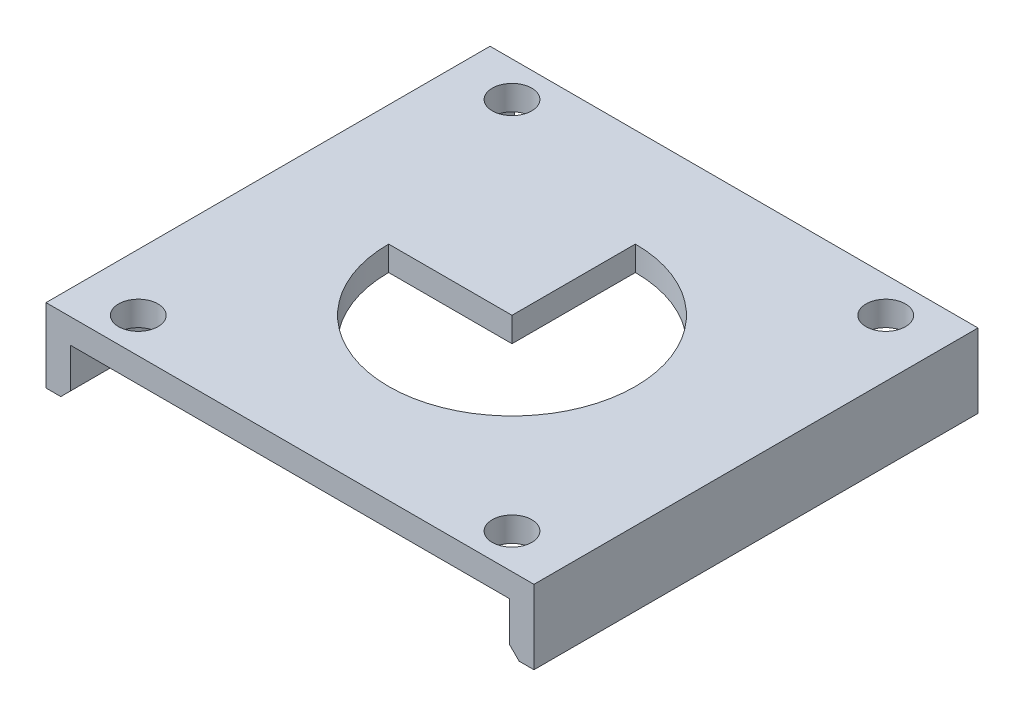
ISO-10303-21;
HEADER;
FILE_DESCRIPTION(('STEP AP214'),'2;1');
FILE_NAME('part.step','',(''),(''),'','','');
FILE_SCHEMA(('AUTOMOTIVE_DESIGN { 1 0 10303 214 1 1 1 1 }'));
ENDSEC;
DATA;
#1=APPLICATION_CONTEXT('core data for automotive mechanical design processes');
#2=APPLICATION_PROTOCOL_DEFINITION('international standard','automotive_design',2000,#1);
#3=PRODUCT_CONTEXT('',#1,'mechanical');
#4=PRODUCT('Part','Part','',(#3));
#5=PRODUCT_RELATED_PRODUCT_CATEGORY('part','',(#4));
#6=PRODUCT_DEFINITION_FORMATION('','',#4);
#7=PRODUCT_DEFINITION_CONTEXT('part definition',#1,'design');
#8=PRODUCT_DEFINITION('design','',#6,#7);
#9=PRODUCT_DEFINITION_SHAPE('','',#8);
#10=(LENGTH_UNIT() NAMED_UNIT(*) SI_UNIT(.MILLI.,.METRE.));
#11=(NAMED_UNIT(*) PLANE_ANGLE_UNIT() SI_UNIT($,.RADIAN.));
#12=(NAMED_UNIT(*) SI_UNIT($,.STERADIAN.) SOLID_ANGLE_UNIT());
#13=UNCERTAINTY_MEASURE_WITH_UNIT(LENGTH_MEASURE(1.E-05),#10,'distance_accuracy_value','');
#14=(GEOMETRIC_REPRESENTATION_CONTEXT(3) GLOBAL_UNCERTAINTY_ASSIGNED_CONTEXT((#13)) GLOBAL_UNIT_ASSIGNED_CONTEXT((#10,
#11,#12)) REPRESENTATION_CONTEXT('',''));
#15=CARTESIAN_POINT('',(0.,0.,0.));
#16=DIRECTION('',(0.,0.,1.));
#17=DIRECTION('',(1.,0.,0.));
#18=AXIS2_PLACEMENT_3D('',#15,#16,#17);
#19=CARTESIAN_POINT('',(0.,0.,0.));
#20=DIRECTION('',(0.,1.,0.));
#21=DIRECTION('',(0.,0.,1.));
#22=AXIS2_PLACEMENT_3D('',#19,#20,#21);
#23=PLANE('',#22);
#24=CARTESIAN_POINT('',(37.875,0.,37.875));
#25=DIRECTION('',(0.,1.,0.));
#26=DIRECTION('',(0.,0.,1.));
#27=AXIS2_PLACEMENT_3D('',#24,#25,#26);
#28=CIRCLE('',#27,4.00000000000001);
#29=CARTESIAN_POINT('',(37.875,0.,41.875));
#30=VERTEX_POINT('',#29);
#31=EDGE_CURVE('E174',#30,#30,#28,.T.);
#32=ORIENTED_EDGE('',*,*,#31,.T.);
#33=EDGE_LOOP('',(#32));
#34=FACE_BOUND('',#33,.T.);
#35=CARTESIAN_POINT('',(-37.875,0.,37.875));
#36=DIRECTION('',(0.,1.,0.));
#37=DIRECTION('',(0.,0.,1.));
#38=AXIS2_PLACEMENT_3D('',#35,#36,#37);
#39=CIRCLE('',#38,4.);
#40=CARTESIAN_POINT('',(-37.875,0.,41.875));
#41=VERTEX_POINT('',#40);
#42=EDGE_CURVE('E222',#41,#41,#39,.T.);
#43=ORIENTED_EDGE('',*,*,#42,.T.);
#44=EDGE_LOOP('',(#43));
#45=FACE_BOUND('',#44,.T.);
#46=CARTESIAN_POINT('',(37.875,0.,-37.875));
#47=DIRECTION('',(0.,1.,0.));
#48=DIRECTION('',(0.,0.,1.));
#49=AXIS2_PLACEMENT_3D('',#46,#47,#48);
#50=CIRCLE('',#49,4.00000000000001);
#51=CARTESIAN_POINT('',(37.875,0.,-33.875));
#52=VERTEX_POINT('',#51);
#53=EDGE_CURVE('E225',#52,#52,#50,.T.);
#54=ORIENTED_EDGE('',*,*,#53,.T.);
#55=EDGE_LOOP('',(#54));
#56=FACE_BOUND('',#55,.T.);
#57=CARTESIAN_POINT('',(-37.875,0.,-37.875));
#58=DIRECTION('',(0.,1.,0.));
#59=DIRECTION('',(0.,0.,1.));
#60=AXIS2_PLACEMENT_3D('',#57,#58,#59);
#61=CIRCLE('',#60,4.00000000000001);
#62=CARTESIAN_POINT('',(-37.875,0.,-33.875));
#63=VERTEX_POINT('',#62);
#64=EDGE_CURVE('E228',#63,#63,#61,.T.);
#65=ORIENTED_EDGE('',*,*,#64,.T.);
#66=EDGE_LOOP('',(#65));
#67=FACE_BOUND('',#66,.T.);
#68=CARTESIAN_POINT('',(0.,0.,0.));
#69=DIRECTION('',(0.,1.,0.));
#70=DIRECTION('',(0.,0.,1.));
#71=AXIS2_PLACEMENT_3D('',#68,#69,#70);
#72=CIRCLE('',#71,25.);
#73=CARTESIAN_POINT('',(-25.,0.,0.));
#74=VERTEX_POINT('',#73);
#75=CARTESIAN_POINT('',(0.,0.,-25.));
#76=VERTEX_POINT('',#75);
#77=EDGE_CURVE('E231',#74,#76,#72,.T.);
#78=ORIENTED_EDGE('',*,*,#77,.T.);
#79=DIRECTION('',(0.,0.,1.));
#80=VECTOR('',#79,1.);
#81=CARTESIAN_POINT('',(0.,0.,0.));
#82=LINE('',#81,#80);
#83=CARTESIAN_POINT('',(0.,0.,0.));
#84=VERTEX_POINT('',#83);
#85=EDGE_CURVE('E237',#76,#84,#82,.T.);
#86=ORIENTED_EDGE('',*,*,#85,.T.);
#87=DIRECTION('',(-1.,0.,0.));
#88=VECTOR('',#87,1.);
#89=CARTESIAN_POINT('',(0.,0.,0.));
#90=LINE('',#89,#88);
#91=EDGE_CURVE('E234',#84,#74,#90,.T.);
#92=ORIENTED_EDGE('',*,*,#91,.T.);
#93=EDGE_LOOP('',(#78,#86,#92));
#94=FACE_BOUND('',#93,.T.);
#95=DIRECTION('',(0.,0.,1.));
#96=VECTOR('',#95,1.);
#97=CARTESIAN_POINT('',(-44.45,0.,45.));
#98=LINE('',#97,#96);
#99=CARTESIAN_POINT('',(-44.45,0.,-45.));
#100=VERTEX_POINT('',#99);
#101=CARTESIAN_POINT('',(-44.45,0.,45.));
#102=VERTEX_POINT('',#101);
#103=EDGE_CURVE('E163',#100,#102,#98,.T.);
#104=ORIENTED_EDGE('',*,*,#103,.F.);
#105=DIRECTION('',(1.,0.,0.));
#106=VECTOR('',#105,1.);
#107=CARTESIAN_POINT('',(0.,0.,-45.));
#108=LINE('',#107,#106);
#109=CARTESIAN_POINT('',(44.45,0.,-45.));
#110=VERTEX_POINT('',#109);
#111=EDGE_CURVE('E193',#100,#110,#108,.T.);
#112=ORIENTED_EDGE('',*,*,#111,.T.);
#113=DIRECTION('',(0.,0.,-1.));
#114=VECTOR('',#113,1.);
#115=CARTESIAN_POINT('',(44.45,0.,45.));
#116=LINE('',#115,#114);
#117=CARTESIAN_POINT('',(44.45,0.,45.));
#118=VERTEX_POINT('',#117);
#119=EDGE_CURVE('E166',#118,#110,#116,.T.);
#120=ORIENTED_EDGE('',*,*,#119,.F.);
#121=DIRECTION('',(1.,0.,0.));
#122=VECTOR('',#121,1.);
#123=CARTESIAN_POINT('',(0.,0.,45.));
#124=LINE('',#123,#122);
#125=EDGE_CURVE('E240',#102,#118,#124,.T.);
#126=ORIENTED_EDGE('',*,*,#125,.F.);
#127=EDGE_LOOP('',(#104,#112,#120,#126));
#128=FACE_BOUND('',#127,.T.);
#129=ADVANCED_FACE('F43',(#34,#45,#56,#67,#94,#128),#23,.F.);
#130=CARTESIAN_POINT('',(0.,5.,45.));
#131=DIRECTION('',(0.,0.,-1.));
#132=DIRECTION('',(-1.,0.,0.));
#133=AXIS2_PLACEMENT_3D('',#130,#131,#132);
#134=PLANE('',#133);
#135=DIRECTION('',(0.,1.,0.));
#136=VECTOR('',#135,1.);
#137=CARTESIAN_POINT('',(44.45,-10.,45.));
#138=LINE('',#137,#136);
#139=CARTESIAN_POINT('',(44.45,-8.00000000000003,45.));
#140=VERTEX_POINT('',#139);
#141=EDGE_CURVE('E175',#140,#118,#138,.T.);
#142=ORIENTED_EDGE('',*,*,#141,.F.);
#143=DIRECTION('',(-0.707106781186547,0.707106781186548,0.));
#144=VECTOR('',#143,1.);
#145=CARTESIAN_POINT('',(46.45,-10.,45.));
#146=LINE('',#145,#144);
#147=CARTESIAN_POINT('',(46.45,-10.,45.));
#148=VERTEX_POINT('',#147);
#149=EDGE_CURVE('E264',#140,#148,#146,.F.);
#150=ORIENTED_EDGE('',*,*,#149,.T.);
#151=DIRECTION('',(-1.,0.,0.));
#152=VECTOR('',#151,1.);
#153=CARTESIAN_POINT('',(49.45,-10.,45.));
#154=LINE('',#153,#152);
#155=CARTESIAN_POINT('',(49.45,-10.,45.));
#156=VERTEX_POINT('',#155);
#157=EDGE_CURVE('E184',#156,#148,#154,.T.);
#158=ORIENTED_EDGE('',*,*,#157,.F.);
#159=DIRECTION('',(0.,-1.,0.));
#160=VECTOR('',#159,1.);
#161=CARTESIAN_POINT('',(49.45,5.,45.));
#162=LINE('',#161,#160);
#163=CARTESIAN_POINT('',(49.45,5.,45.));
#164=VERTEX_POINT('',#163);
#165=EDGE_CURVE('E249',#164,#156,#162,.T.);
#166=ORIENTED_EDGE('',*,*,#165,.F.);
#167=DIRECTION('',(1.,0.,0.));
#168=VECTOR('',#167,1.);
#169=CARTESIAN_POINT('',(0.,5.,45.));
#170=LINE('',#169,#168);
#171=CARTESIAN_POINT('',(-49.45,5.,45.));
#172=VERTEX_POINT('',#171);
#173=EDGE_CURVE('E211',#172,#164,#170,.T.);
#174=ORIENTED_EDGE('',*,*,#173,.F.);
#175=DIRECTION('',(0.,-1.,0.));
#176=VECTOR('',#175,1.);
#177=CARTESIAN_POINT('',(-49.45,5.,45.));
#178=LINE('',#177,#176);
#179=CARTESIAN_POINT('',(-49.45,-10.,45.));
#180=VERTEX_POINT('',#179);
#181=EDGE_CURVE('E149',#172,#180,#178,.T.);
#182=ORIENTED_EDGE('',*,*,#181,.T.);
#183=DIRECTION('',(-1.,0.,0.));
#184=VECTOR('',#183,1.);
#185=CARTESIAN_POINT('',(-49.45,-10.,45.));
#186=LINE('',#185,#184);
#187=CARTESIAN_POINT('',(-46.45,-10.,45.));
#188=VERTEX_POINT('',#187);
#189=EDGE_CURVE('E159',#188,#180,#186,.T.);
#190=ORIENTED_EDGE('',*,*,#189,.F.);
#191=DIRECTION('',(0.707106781186548,0.707106781186548,0.));
#192=VECTOR('',#191,1.);
#193=CARTESIAN_POINT('',(-46.45,-10.,45.));
#194=LINE('',#193,#192);
#195=CARTESIAN_POINT('',(-44.45,-8.00000000000003,45.));
#196=VERTEX_POINT('',#195);
#197=EDGE_CURVE('E59',#188,#196,#194,.T.);
#198=ORIENTED_EDGE('',*,*,#197,.T.);
#199=DIRECTION('',(0.,1.,0.));
#200=VECTOR('',#199,1.);
#201=CARTESIAN_POINT('',(-44.45,-10.,45.));
#202=LINE('',#201,#200);
#203=EDGE_CURVE('E169',#196,#102,#202,.T.);
#204=ORIENTED_EDGE('',*,*,#203,.T.);
#205=ORIENTED_EDGE('',*,*,#125,.T.);
#206=EDGE_LOOP('',(#142,#150,#158,#166,#174,#182,#190,#198,#204,#205));
#207=FACE_BOUND('',#206,.T.);
#208=ADVANCED_FACE('F266',(#207),#134,.F.);
#209=CARTESIAN_POINT('',(49.45,5.,0.));
#210=DIRECTION('',(-1.,0.,0.));
#211=DIRECTION('',(0.,0.,1.));
#212=AXIS2_PLACEMENT_3D('',#209,#210,#211);
#213=PLANE('',#212);
#214=ORIENTED_EDGE('',*,*,#165,.T.);
#215=DIRECTION('',(0.,0.,1.));
#216=VECTOR('',#215,1.);
#217=CARTESIAN_POINT('',(49.45,-10.,45.));
#218=LINE('',#217,#216);
#219=CARTESIAN_POINT('',(49.45,-10.,-45.));
#220=VERTEX_POINT('',#219);
#221=EDGE_CURVE('E182',#220,#156,#218,.T.);
#222=ORIENTED_EDGE('',*,*,#221,.F.);
#223=DIRECTION('',(0.,-1.,0.));
#224=VECTOR('',#223,1.);
#225=CARTESIAN_POINT('',(49.45,5.,-45.));
#226=LINE('',#225,#224);
#227=CARTESIAN_POINT('',(49.45,5.,-45.));
#228=VERTEX_POINT('',#227);
#229=EDGE_CURVE('E148',#228,#220,#226,.T.);
#230=ORIENTED_EDGE('',*,*,#229,.F.);
#231=DIRECTION('',(0.,0.,-1.));
#232=VECTOR('',#231,1.);
#233=CARTESIAN_POINT('',(49.45,5.,0.));
#234=LINE('',#233,#232);
#235=EDGE_CURVE('E214',#164,#228,#234,.T.);
#236=ORIENTED_EDGE('',*,*,#235,.F.);
#237=EDGE_LOOP('',(#214,#222,#230,#236));
#238=FACE_BOUND('',#237,.T.);
#239=ADVANCED_FACE('F275',(#238),#213,.F.);
#240=CARTESIAN_POINT('',(0.,5.,-45.));
#241=DIRECTION('',(0.,0.,-1.));
#242=DIRECTION('',(-1.,0.,0.));
#243=AXIS2_PLACEMENT_3D('',#240,#241,#242);
#244=PLANE('',#243);
#245=DIRECTION('',(1.,0.,0.));
#246=VECTOR('',#245,1.);
#247=CARTESIAN_POINT('',(49.45,-10.,-45.));
#248=LINE('',#247,#246);
#249=CARTESIAN_POINT('',(46.45,-10.,-45.));
#250=VERTEX_POINT('',#249);
#251=EDGE_CURVE('E179',#250,#220,#248,.T.);
#252=ORIENTED_EDGE('',*,*,#251,.F.);
#253=DIRECTION('',(0.707106781186547,-0.707106781186548,0.));
#254=VECTOR('',#253,1.);
#255=CARTESIAN_POINT('',(15.725,20.725,-45.));
#256=LINE('',#255,#254);
#257=CARTESIAN_POINT('',(44.45,-8.00000000000003,-45.));
#258=VERTEX_POINT('',#257);
#259=EDGE_CURVE('E259',#250,#258,#256,.F.);
#260=ORIENTED_EDGE('',*,*,#259,.T.);
#261=DIRECTION('',(0.,1.,0.));
#262=VECTOR('',#261,1.);
#263=CARTESIAN_POINT('',(44.45,-10.,-45.));
#264=LINE('',#263,#262);
#265=EDGE_CURVE('E177',#258,#110,#264,.T.);
#266=ORIENTED_EDGE('',*,*,#265,.T.);
#267=ORIENTED_EDGE('',*,*,#111,.F.);
#268=DIRECTION('',(0.,1.,0.));
#269=VECTOR('',#268,1.);
#270=CARTESIAN_POINT('',(-44.45,-10.,-45.));
#271=LINE('',#270,#269);
#272=CARTESIAN_POINT('',(-44.45,-8.00000000000003,-45.));
#273=VERTEX_POINT('',#272);
#274=EDGE_CURVE('E172',#273,#100,#271,.T.);
#275=ORIENTED_EDGE('',*,*,#274,.F.);
#276=DIRECTION('',(-0.707106781186548,-0.707106781186548,0.));
#277=VECTOR('',#276,1.);
#278=CARTESIAN_POINT('',(-15.725,20.725,-45.));
#279=LINE('',#278,#277);
#280=CARTESIAN_POINT('',(-46.45,-10.,-45.));
#281=VERTEX_POINT('',#280);
#282=EDGE_CURVE('E157',#273,#281,#279,.T.);
#283=ORIENTED_EDGE('',*,*,#282,.T.);
#284=DIRECTION('',(1.,0.,0.));
#285=VECTOR('',#284,1.);
#286=CARTESIAN_POINT('',(-49.45,-10.,-45.));
#287=LINE('',#286,#285);
#288=CARTESIAN_POINT('',(-49.45,-10.,-45.));
#289=VERTEX_POINT('',#288);
#290=EDGE_CURVE('E152',#289,#281,#287,.T.);
#291=ORIENTED_EDGE('',*,*,#290,.F.);
#292=DIRECTION('',(0.,-1.,0.));
#293=VECTOR('',#292,1.);
#294=CARTESIAN_POINT('',(-49.45,5.,-45.));
#295=LINE('',#294,#293);
#296=CARTESIAN_POINT('',(-49.45,5.,-45.));
#297=VERTEX_POINT('',#296);
#298=EDGE_CURVE('E138',#297,#289,#295,.T.);
#299=ORIENTED_EDGE('',*,*,#298,.F.);
#300=DIRECTION('',(1.,0.,0.));
#301=VECTOR('',#300,1.);
#302=CARTESIAN_POINT('',(0.,5.,-45.));
#303=LINE('',#302,#301);
#304=EDGE_CURVE('E216',#297,#228,#303,.T.);
#305=ORIENTED_EDGE('',*,*,#304,.T.);
#306=ORIENTED_EDGE('',*,*,#229,.T.);
#307=EDGE_LOOP('',(#252,#260,#266,#267,#275,#283,#291,#299,#305,#306));
#308=FACE_BOUND('',#307,.T.);
#309=ADVANCED_FACE('F154',(#308),#244,.T.);
#310=CARTESIAN_POINT('',(0.,5.,0.));
#311=DIRECTION('',(0.,-1.,0.));
#312=DIRECTION('',(0.,0.,-1.));
#313=AXIS2_PLACEMENT_3D('',#310,#311,#312);
#314=CYLINDRICAL_SURFACE('',#313,25.);
#315=ORIENTED_EDGE('',*,*,#77,.F.);
#316=DIRECTION('',(0.,-1.,0.));
#317=VECTOR('',#316,1.);
#318=CARTESIAN_POINT('',(-25.,5.,0.));
#319=LINE('',#318,#317);
#320=CARTESIAN_POINT('',(-25.,5.,0.));
#321=VERTEX_POINT('',#320);
#322=EDGE_CURVE('E245',#321,#74,#319,.T.);
#323=ORIENTED_EDGE('',*,*,#322,.F.);
#324=CARTESIAN_POINT('',(0.,5.,0.));
#325=DIRECTION('',(0.,1.,0.));
#326=DIRECTION('',(0.,0.,1.));
#327=AXIS2_PLACEMENT_3D('',#324,#325,#326);
#328=CIRCLE('',#327,25.);
#329=CARTESIAN_POINT('',(0.,5.,-25.));
#330=VERTEX_POINT('',#329);
#331=EDGE_CURVE('E202',#321,#330,#328,.T.);
#332=ORIENTED_EDGE('',*,*,#331,.T.);
#333=DIRECTION('',(0.,-1.,0.));
#334=VECTOR('',#333,1.);
#335=CARTESIAN_POINT('',(0.,5.,-25.));
#336=LINE('',#335,#334);
#337=EDGE_CURVE('E219',#330,#76,#336,.T.);
#338=ORIENTED_EDGE('',*,*,#337,.T.);
#339=EDGE_LOOP('',(#315,#323,#332,#338));
#340=FACE_BOUND('',#339,.T.);
#341=ADVANCED_FACE('F315',(#340),#314,.F.);
#342=CARTESIAN_POINT('',(0.,5.,0.));
#343=DIRECTION('',(0.,0.,1.));
#344=DIRECTION('',(1.,0.,0.));
#345=AXIS2_PLACEMENT_3D('',#342,#343,#344);
#346=PLANE('',#345);
#347=ORIENTED_EDGE('',*,*,#91,.F.);
#348=DIRECTION('',(0.,-1.,0.));
#349=VECTOR('',#348,1.);
#350=CARTESIAN_POINT('',(0.,5.,0.));
#351=LINE('',#350,#349);
#352=CARTESIAN_POINT('',(0.,5.,0.));
#353=VERTEX_POINT('',#352);
#354=EDGE_CURVE('E253',#353,#84,#351,.T.);
#355=ORIENTED_EDGE('',*,*,#354,.F.);
#356=DIRECTION('',(-1.,0.,0.));
#357=VECTOR('',#356,1.);
#358=CARTESIAN_POINT('',(0.,5.,0.));
#359=LINE('',#358,#357);
#360=EDGE_CURVE('E205',#353,#321,#359,.T.);
#361=ORIENTED_EDGE('',*,*,#360,.T.);
#362=ORIENTED_EDGE('',*,*,#322,.T.);
#363=EDGE_LOOP('',(#347,#355,#361,#362));
#364=FACE_BOUND('',#363,.T.);
#365=ADVANCED_FACE('F321',(#364),#346,.T.);
#366=CARTESIAN_POINT('',(0.,5.,0.));
#367=DIRECTION('',(1.,0.,0.));
#368=DIRECTION('',(0.,0.,-1.));
#369=AXIS2_PLACEMENT_3D('',#366,#367,#368);
#370=PLANE('',#369);
#371=ORIENTED_EDGE('',*,*,#85,.F.);
#372=ORIENTED_EDGE('',*,*,#337,.F.);
#373=DIRECTION('',(0.,0.,1.));
#374=VECTOR('',#373,1.);
#375=CARTESIAN_POINT('',(0.,5.,0.));
#376=LINE('',#375,#374);
#377=EDGE_CURVE('E208',#330,#353,#376,.T.);
#378=ORIENTED_EDGE('',*,*,#377,.T.);
#379=ORIENTED_EDGE('',*,*,#354,.T.);
#380=EDGE_LOOP('',(#371,#372,#378,#379));
#381=FACE_BOUND('',#380,.T.);
#382=ADVANCED_FACE('F317',(#381),#370,.T.);
#383=CARTESIAN_POINT('',(-37.875,5.,-37.875));
#384=DIRECTION('',(0.,-1.,0.));
#385=DIRECTION('',(0.,0.,-1.));
#386=AXIS2_PLACEMENT_3D('',#383,#384,#385);
#387=CYLINDRICAL_SURFACE('',#386,4.00000000000001);
#388=CARTESIAN_POINT('',(-37.875,5.,-37.875));
#389=DIRECTION('',(0.,1.,0.));
#390=DIRECTION('',(0.,0.,1.));
#391=AXIS2_PLACEMENT_3D('',#388,#389,#390);
#392=CIRCLE('',#391,4.00000000000001);
#393=CARTESIAN_POINT('',(-37.875,5.,-33.875));
#394=VERTEX_POINT('',#393);
#395=EDGE_CURVE('E199',#394,#394,#392,.T.);
#396=ORIENTED_EDGE('',*,*,#395,.T.);
#397=EDGE_LOOP('',(#396));
#398=FACE_BOUND('',#397,.T.);
#399=ORIENTED_EDGE('',*,*,#64,.F.);
#400=EDGE_LOOP('',(#399));
#401=FACE_BOUND('',#400,.T.);
#402=ADVANCED_FACE('F320',(#398,#401),#387,.F.);
#403=CARTESIAN_POINT('',(37.875,5.,-37.875));
#404=DIRECTION('',(0.,-1.,0.));
#405=DIRECTION('',(0.,0.,-1.));
#406=AXIS2_PLACEMENT_3D('',#403,#404,#405);
#407=CYLINDRICAL_SURFACE('',#406,4.00000000000001);
#408=CARTESIAN_POINT('',(37.875,5.,-37.875));
#409=DIRECTION('',(0.,1.,0.));
#410=DIRECTION('',(0.,0.,1.));
#411=AXIS2_PLACEMENT_3D('',#408,#409,#410);
#412=CIRCLE('',#411,4.00000000000001);
#413=CARTESIAN_POINT('',(37.875,5.,-33.875));
#414=VERTEX_POINT('',#413);
#415=EDGE_CURVE('E196',#414,#414,#412,.T.);
#416=ORIENTED_EDGE('',*,*,#415,.T.);
#417=EDGE_LOOP('',(#416));
#418=FACE_BOUND('',#417,.T.);
#419=ORIENTED_EDGE('',*,*,#53,.F.);
#420=EDGE_LOOP('',(#419));
#421=FACE_BOUND('',#420,.T.);
#422=ADVANCED_FACE('F331',(#418,#421),#407,.F.);
#423=CARTESIAN_POINT('',(-37.875,5.,37.875));
#424=DIRECTION('',(0.,-1.,0.));
#425=DIRECTION('',(0.,0.,-1.));
#426=AXIS2_PLACEMENT_3D('',#423,#424,#425);
#427=CYLINDRICAL_SURFACE('',#426,4.);
#428=CARTESIAN_POINT('',(-37.875,5.,37.875));
#429=DIRECTION('',(0.,1.,0.));
#430=DIRECTION('',(0.,0.,1.));
#431=AXIS2_PLACEMENT_3D('',#428,#429,#430);
#432=CIRCLE('',#431,4.);
#433=CARTESIAN_POINT('',(-37.875,5.,41.875));
#434=VERTEX_POINT('',#433);
#435=EDGE_CURVE('E192',#434,#434,#432,.T.);
#436=ORIENTED_EDGE('',*,*,#435,.T.);
#437=EDGE_LOOP('',(#436));
#438=FACE_BOUND('',#437,.T.);
#439=ORIENTED_EDGE('',*,*,#42,.F.);
#440=EDGE_LOOP('',(#439));
#441=FACE_BOUND('',#440,.T.);
#442=ADVANCED_FACE('F335',(#438,#441),#427,.F.);
#443=CARTESIAN_POINT('',(37.875,5.,37.875));
#444=DIRECTION('',(0.,-1.,0.));
#445=DIRECTION('',(0.,0.,-1.));
#446=AXIS2_PLACEMENT_3D('',#443,#444,#445);
#447=CYLINDRICAL_SURFACE('',#446,4.00000000000001);
#448=CARTESIAN_POINT('',(37.875,5.,37.875));
#449=DIRECTION('',(0.,1.,0.));
#450=DIRECTION('',(0.,0.,1.));
#451=AXIS2_PLACEMENT_3D('',#448,#449,#450);
#452=CIRCLE('',#451,4.00000000000001);
#453=CARTESIAN_POINT('',(37.875,5.,41.875));
#454=VERTEX_POINT('',#453);
#455=EDGE_CURVE('E189',#454,#454,#452,.T.);
#456=ORIENTED_EDGE('',*,*,#455,.T.);
#457=EDGE_LOOP('',(#456));
#458=FACE_BOUND('',#457,.T.);
#459=ORIENTED_EDGE('',*,*,#31,.F.);
#460=EDGE_LOOP('',(#459));
#461=FACE_BOUND('',#460,.T.);
#462=ADVANCED_FACE('F312',(#458,#461),#447,.F.);
#463=CARTESIAN_POINT('',(-49.45,5.,0.));
#464=DIRECTION('',(-1.,0.,0.));
#465=DIRECTION('',(0.,0.,1.));
#466=AXIS2_PLACEMENT_3D('',#463,#464,#465);
#467=PLANE('',#466);
#468=ORIENTED_EDGE('',*,*,#298,.T.);
#469=DIRECTION('',(0.,0.,-1.));
#470=VECTOR('',#469,1.);
#471=CARTESIAN_POINT('',(-49.45,-10.,45.));
#472=LINE('',#471,#470);
#473=EDGE_CURVE('E142',#180,#289,#472,.T.);
#474=ORIENTED_EDGE('',*,*,#473,.F.);
#475=ORIENTED_EDGE('',*,*,#181,.F.);
#476=DIRECTION('',(0.,0.,-1.));
#477=VECTOR('',#476,1.);
#478=CARTESIAN_POINT('',(-49.45,5.,0.));
#479=LINE('',#478,#477);
#480=EDGE_CURVE('E144',#172,#297,#479,.T.);
#481=ORIENTED_EDGE('',*,*,#480,.T.);
#482=EDGE_LOOP('',(#468,#474,#475,#481));
#483=FACE_BOUND('',#482,.T.);
#484=ADVANCED_FACE('F140',(#483),#467,.T.);
#485=CARTESIAN_POINT('',(0.,5.,0.));
#486=DIRECTION('',(0.,1.,0.));
#487=DIRECTION('',(0.,0.,1.));
#488=AXIS2_PLACEMENT_3D('',#485,#486,#487);
#489=PLANE('',#488);
#490=ORIENTED_EDGE('',*,*,#455,.F.);
#491=EDGE_LOOP('',(#490));
#492=FACE_BOUND('',#491,.T.);
#493=ORIENTED_EDGE('',*,*,#435,.F.);
#494=EDGE_LOOP('',(#493));
#495=FACE_BOUND('',#494,.T.);
#496=ORIENTED_EDGE('',*,*,#415,.F.);
#497=EDGE_LOOP('',(#496));
#498=FACE_BOUND('',#497,.T.);
#499=ORIENTED_EDGE('',*,*,#395,.F.);
#500=EDGE_LOOP('',(#499));
#501=FACE_BOUND('',#500,.T.);
#502=ORIENTED_EDGE('',*,*,#331,.F.);
#503=ORIENTED_EDGE('',*,*,#360,.F.);
#504=ORIENTED_EDGE('',*,*,#377,.F.);
#505=EDGE_LOOP('',(#502,#503,#504));
#506=FACE_BOUND('',#505,.T.);
#507=ORIENTED_EDGE('',*,*,#173,.T.);
#508=ORIENTED_EDGE('',*,*,#235,.T.);
#509=ORIENTED_EDGE('',*,*,#304,.F.);
#510=ORIENTED_EDGE('',*,*,#480,.F.);
#511=EDGE_LOOP('',(#507,#508,#509,#510));
#512=FACE_BOUND('',#511,.T.);
#513=ADVANCED_FACE('F271',(#492,#495,#498,#501,#506,#512),#489,.T.);
#514=CARTESIAN_POINT('',(44.45,-10.,45.));
#515=DIRECTION('',(1.,0.,0.));
#516=DIRECTION('',(0.,0.,-1.));
#517=AXIS2_PLACEMENT_3D('',#514,#515,#516);
#518=PLANE('',#517);
#519=ORIENTED_EDGE('',*,*,#265,.F.);
#520=DIRECTION('',(0.,0.,1.));
#521=VECTOR('',#520,1.);
#522=CARTESIAN_POINT('',(44.45,-8.00000000000003,45.));
#523=LINE('',#522,#521);
#524=EDGE_CURVE('E261',#258,#140,#523,.T.);
#525=ORIENTED_EDGE('',*,*,#524,.T.);
#526=ORIENTED_EDGE('',*,*,#141,.T.);
#527=ORIENTED_EDGE('',*,*,#119,.T.);
#528=EDGE_LOOP('',(#519,#525,#526,#527));
#529=FACE_BOUND('',#528,.T.);
#530=ADVANCED_FACE('F286',(#529),#518,.F.);
#531=CARTESIAN_POINT('',(0.,-10.,0.));
#532=DIRECTION('',(0.,1.,0.));
#533=DIRECTION('',(0.,0.,1.));
#534=AXIS2_PLACEMENT_3D('',#531,#532,#533);
#535=PLANE('',#534);
#536=ORIENTED_EDGE('',*,*,#157,.T.);
#537=DIRECTION('',(0.,0.,-1.));
#538=VECTOR('',#537,1.);
#539=CARTESIAN_POINT('',(46.45,-10.,0.));
#540=LINE('',#539,#538);
#541=EDGE_CURVE('E251',#148,#250,#540,.T.);
#542=ORIENTED_EDGE('',*,*,#541,.T.);
#543=ORIENTED_EDGE('',*,*,#251,.T.);
#544=ORIENTED_EDGE('',*,*,#221,.T.);
#545=EDGE_LOOP('',(#536,#542,#543,#544));
#546=FACE_BOUND('',#545,.T.);
#547=ADVANCED_FACE('F277',(#546),#535,.F.);
#548=CARTESIAN_POINT('',(-44.45,-10.,45.));
#549=DIRECTION('',(-1.,0.,0.));
#550=DIRECTION('',(0.,0.,1.));
#551=AXIS2_PLACEMENT_3D('',#548,#549,#550);
#552=PLANE('',#551);
#553=ORIENTED_EDGE('',*,*,#203,.F.);
#554=DIRECTION('',(0.,0.,-1.));
#555=VECTOR('',#554,1.);
#556=CARTESIAN_POINT('',(-44.45,-8.00000000000003,-45.));
#557=LINE('',#556,#555);
#558=EDGE_CURVE('E11',#196,#273,#557,.T.);
#559=ORIENTED_EDGE('',*,*,#558,.T.);
#560=ORIENTED_EDGE('',*,*,#274,.T.);
#561=ORIENTED_EDGE('',*,*,#103,.T.);
#562=EDGE_LOOP('',(#553,#559,#560,#561));
#563=FACE_BOUND('',#562,.T.);
#564=ADVANCED_FACE('F292',(#563),#552,.F.);
#565=CARTESIAN_POINT('',(0.,-10.,0.));
#566=DIRECTION('',(0.,-1.,0.));
#567=DIRECTION('',(0.,0.,-1.));
#568=AXIS2_PLACEMENT_3D('',#565,#566,#567);
#569=PLANE('',#568);
#570=ORIENTED_EDGE('',*,*,#290,.T.);
#571=DIRECTION('',(0.,0.,1.));
#572=VECTOR('',#571,1.);
#573=CARTESIAN_POINT('',(-46.45,-10.,45.));
#574=LINE('',#573,#572);
#575=EDGE_CURVE('E52',#281,#188,#574,.T.);
#576=ORIENTED_EDGE('',*,*,#575,.T.);
#577=ORIENTED_EDGE('',*,*,#189,.T.);
#578=ORIENTED_EDGE('',*,*,#473,.T.);
#579=EDGE_LOOP('',(#570,#576,#577,#578));
#580=FACE_BOUND('',#579,.T.);
#581=ADVANCED_FACE('F161',(#580),#569,.T.);
#582=CARTESIAN_POINT('',(46.45,-10.,0.));
#583=DIRECTION('',(0.707106781186548,0.707106781186547,0.));
#584=DIRECTION('',(0.,0.,-1.));
#585=AXIS2_PLACEMENT_3D('',#582,#583,#584);
#586=PLANE('',#585);
#587=ORIENTED_EDGE('',*,*,#149,.F.);
#588=ORIENTED_EDGE('',*,*,#524,.F.);
#589=ORIENTED_EDGE('',*,*,#259,.F.);
#590=ORIENTED_EDGE('',*,*,#541,.F.);
#591=EDGE_LOOP('',(#587,#588,#589,#590));
#592=FACE_BOUND('',#591,.T.);
#593=ADVANCED_FACE('F281',(#592),#586,.F.);
#594=CARTESIAN_POINT('',(-46.45,-10.,0.));
#595=DIRECTION('',(0.707106781186547,-0.707106781186547,0.));
#596=DIRECTION('',(0.,0.,-1.));
#597=AXIS2_PLACEMENT_3D('',#594,#595,#596);
#598=PLANE('',#597);
#599=ORIENTED_EDGE('',*,*,#282,.F.);
#600=ORIENTED_EDGE('',*,*,#558,.F.);
#601=ORIENTED_EDGE('',*,*,#197,.F.);
#602=ORIENTED_EDGE('',*,*,#575,.F.);
#603=EDGE_LOOP('',(#599,#600,#601,#602));
#604=FACE_BOUND('',#603,.T.);
#605=ADVANCED_FACE('F46',(#604),#598,.T.);
#606=CLOSED_SHELL('',(#129,#208,#239,#309,#341,#365,#382,#402,#422,#442,#462,#484,#513,#530,
#547,#564,#581,#593,#605));
#607=MANIFOLD_SOLID_BREP('B2',#606);
#608=ADVANCED_BREP_SHAPE_REPRESENTATION('',(#18,#607),#14);
#609=SHAPE_DEFINITION_REPRESENTATION(#9,#608);
ENDSEC;
END-ISO-10303-21;
